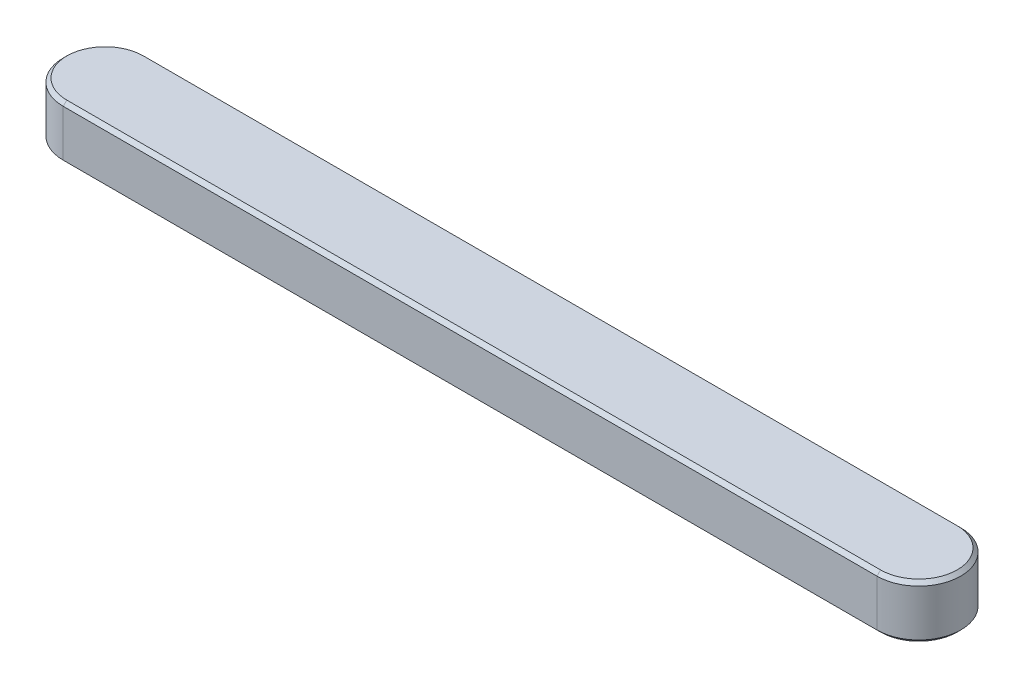
ISO-10303-21;
HEADER;
FILE_DESCRIPTION(('STEP AP214'),'2;1');
FILE_NAME('part.step','',(''),(''),'','','');
FILE_SCHEMA(('AUTOMOTIVE_DESIGN { 1 0 10303 214 1 1 1 1 }'));
ENDSEC;
DATA;
#1=APPLICATION_CONTEXT('core data for automotive mechanical design processes');
#2=APPLICATION_PROTOCOL_DEFINITION('international standard','automotive_design',2000,#1);
#3=PRODUCT_CONTEXT('',#1,'mechanical');
#4=PRODUCT('Part','Part','',(#3));
#5=PRODUCT_RELATED_PRODUCT_CATEGORY('part','',(#4));
#6=PRODUCT_DEFINITION_FORMATION('','',#4);
#7=PRODUCT_DEFINITION_CONTEXT('part definition',#1,'design');
#8=PRODUCT_DEFINITION('design','',#6,#7);
#9=PRODUCT_DEFINITION_SHAPE('','',#8);
#10=(LENGTH_UNIT() NAMED_UNIT(*) SI_UNIT(.MILLI.,.METRE.));
#11=(NAMED_UNIT(*) PLANE_ANGLE_UNIT() SI_UNIT($,.RADIAN.));
#12=(NAMED_UNIT(*) SI_UNIT($,.STERADIAN.) SOLID_ANGLE_UNIT());
#13=UNCERTAINTY_MEASURE_WITH_UNIT(LENGTH_MEASURE(1.E-05),#10,'distance_accuracy_value','');
#14=(GEOMETRIC_REPRESENTATION_CONTEXT(3) GLOBAL_UNCERTAINTY_ASSIGNED_CONTEXT((#13)) GLOBAL_UNIT_ASSIGNED_CONTEXT((#10,
#11,#12)) REPRESENTATION_CONTEXT('',''));
#15=CARTESIAN_POINT('',(0.,0.,0.));
#16=DIRECTION('',(0.,0.,1.));
#17=DIRECTION('',(1.,0.,0.));
#18=AXIS2_PLACEMENT_3D('',#15,#16,#17);
#19=CARTESIAN_POINT('',(7.,0.,0.));
#20=DIRECTION('',(0.,-1.,0.));
#21=DIRECTION('',(0.,0.,-1.));
#22=AXIS2_PLACEMENT_3D('',#19,#20,#21);
#23=PLANE('',#22);
#24=DIRECTION('',(1.,0.,0.));
#25=VECTOR('',#24,1.);
#26=CARTESIAN_POINT('',(7.,0.,-6.4));
#27=LINE('',#26,#25);
#28=CARTESIAN_POINT('',(7.,0.,-6.4));
#29=VERTEX_POINT('',#28);
#30=CARTESIAN_POINT('',(143.,0.,-6.4));
#31=VERTEX_POINT('',#30);
#32=EDGE_CURVE('E11',#29,#31,#27,.T.);
#33=ORIENTED_EDGE('',*,*,#32,.T.);
#34=CARTESIAN_POINT('',(143.,0.,0.));
#35=DIRECTION('',(0.,-1.,0.));
#36=DIRECTION('',(0.,0.,-1.));
#37=AXIS2_PLACEMENT_3D('',#34,#35,#36);
#38=CIRCLE('',#37,6.4);
#39=CARTESIAN_POINT('',(143.,0.,6.4));
#40=VERTEX_POINT('',#39);
#41=EDGE_CURVE('E121',#31,#40,#38,.T.);
#42=ORIENTED_EDGE('',*,*,#41,.T.);
#43=DIRECTION('',(1.,0.,0.));
#44=VECTOR('',#43,1.);
#45=CARTESIAN_POINT('',(7.,0.,6.4));
#46=LINE('',#45,#44);
#47=CARTESIAN_POINT('',(7.,0.,6.4));
#48=VERTEX_POINT('',#47);
#49=EDGE_CURVE('E91',#48,#40,#46,.T.);
#50=ORIENTED_EDGE('',*,*,#49,.F.);
#51=CARTESIAN_POINT('',(7.,0.,0.));
#52=DIRECTION('',(0.,1.,0.));
#53=DIRECTION('',(0.,0.,-1.));
#54=AXIS2_PLACEMENT_3D('',#51,#52,#53);
#55=CIRCLE('',#54,6.4);
#56=EDGE_CURVE('E104',#29,#48,#55,.T.);
#57=ORIENTED_EDGE('',*,*,#56,.F.);
#58=EDGE_LOOP('',(#33,#42,#50,#57));
#59=FACE_BOUND('',#58,.T.);
#60=ADVANCED_FACE('F16',(#59),#23,.T.);
#61=CARTESIAN_POINT('',(7.,0.3,-6.7));
#62=DIRECTION('',(0.,-0.707106781186547,-0.707106781186548));
#63=DIRECTION('',(0.,0.707106781186548,-0.707106781186547));
#64=AXIS2_PLACEMENT_3D('',#61,#62,#63);
#65=PLANE('',#64);
#66=DIRECTION('',(0.,-0.707106781186548,0.707106781186547));
#67=VECTOR('',#66,1.);
#68=CARTESIAN_POINT('',(143.,0.,-6.4));
#69=LINE('',#68,#67);
#70=CARTESIAN_POINT('',(143.,0.6,-7.));
#71=VERTEX_POINT('',#70);
#72=EDGE_CURVE('E119',#71,#31,#69,.T.);
#73=ORIENTED_EDGE('',*,*,#72,.T.);
#74=ORIENTED_EDGE('',*,*,#32,.F.);
#75=DIRECTION('',(0.,0.707106781186548,-0.707106781186547));
#76=VECTOR('',#75,1.);
#77=CARTESIAN_POINT('',(7.,0.,-6.4));
#78=LINE('',#77,#76);
#79=CARTESIAN_POINT('',(7.,0.6,-7.));
#80=VERTEX_POINT('',#79);
#81=EDGE_CURVE('E114',#29,#80,#78,.T.);
#82=ORIENTED_EDGE('',*,*,#81,.T.);
#83=DIRECTION('',(1.,0.,0.));
#84=VECTOR('',#83,1.);
#85=CARTESIAN_POINT('',(7.,0.6,-7.));
#86=LINE('',#85,#84);
#87=EDGE_CURVE('E26',#80,#71,#86,.T.);
#88=ORIENTED_EDGE('',*,*,#87,.T.);
#89=EDGE_LOOP('',(#73,#74,#82,#88));
#90=FACE_BOUND('',#89,.T.);
#91=ADVANCED_FACE('F18',(#90),#65,.T.);
#92=CARTESIAN_POINT('',(7.,4.5,-7.));
#93=DIRECTION('',(0.,0.,-1.));
#94=DIRECTION('',(0.,1.,0.));
#95=AXIS2_PLACEMENT_3D('',#92,#93,#94);
#96=PLANE('',#95);
#97=DIRECTION('',(0.,-1.,0.));
#98=VECTOR('',#97,1.);
#99=CARTESIAN_POINT('',(143.,0.6,-7.));
#100=LINE('',#99,#98);
#101=CARTESIAN_POINT('',(143.,8.4,-7.));
#102=VERTEX_POINT('',#101);
#103=EDGE_CURVE('E138',#102,#71,#100,.T.);
#104=ORIENTED_EDGE('',*,*,#103,.T.);
#105=ORIENTED_EDGE('',*,*,#87,.F.);
#106=DIRECTION('',(0.,1.,0.));
#107=VECTOR('',#106,1.);
#108=CARTESIAN_POINT('',(7.,0.6,-7.));
#109=LINE('',#108,#107);
#110=CARTESIAN_POINT('',(7.,8.4,-7.));
#111=VERTEX_POINT('',#110);
#112=EDGE_CURVE('E111',#80,#111,#109,.T.);
#113=ORIENTED_EDGE('',*,*,#112,.T.);
#114=DIRECTION('',(1.,0.,0.));
#115=VECTOR('',#114,1.);
#116=CARTESIAN_POINT('',(7.,8.4,-7.));
#117=LINE('',#116,#115);
#118=EDGE_CURVE('E147',#111,#102,#117,.T.);
#119=ORIENTED_EDGE('',*,*,#118,.T.);
#120=EDGE_LOOP('',(#104,#105,#113,#119));
#121=FACE_BOUND('',#120,.T.);
#122=ADVANCED_FACE('F175',(#121),#96,.T.);
#123=CARTESIAN_POINT('',(7.,8.7,-6.7));
#124=DIRECTION('',(0.,0.707106781186548,-0.707106781186548));
#125=DIRECTION('',(0.,0.707106781186548,0.707106781186548));
#126=AXIS2_PLACEMENT_3D('',#123,#124,#125);
#127=PLANE('',#126);
#128=DIRECTION('',(0.,-0.707106781186548,-0.707106781186548));
#129=VECTOR('',#128,1.);
#130=CARTESIAN_POINT('',(143.,8.4,-7.));
#131=LINE('',#130,#129);
#132=CARTESIAN_POINT('',(143.,9.,-6.4));
#133=VERTEX_POINT('',#132);
#134=EDGE_CURVE('E134',#133,#102,#131,.T.);
#135=ORIENTED_EDGE('',*,*,#134,.T.);
#136=ORIENTED_EDGE('',*,*,#118,.F.);
#137=DIRECTION('',(0.,0.707106781186548,0.707106781186548));
#138=VECTOR('',#137,1.);
#139=CARTESIAN_POINT('',(7.,8.4,-7.));
#140=LINE('',#139,#138);
#141=CARTESIAN_POINT('',(7.,9.,-6.4));
#142=VERTEX_POINT('',#141);
#143=EDGE_CURVE('E92',#111,#142,#140,.T.);
#144=ORIENTED_EDGE('',*,*,#143,.T.);
#145=DIRECTION('',(1.,0.,0.));
#146=VECTOR('',#145,1.);
#147=CARTESIAN_POINT('',(7.,9.,-6.4));
#148=LINE('',#147,#146);
#149=EDGE_CURVE('E35',#142,#133,#148,.T.);
#150=ORIENTED_EDGE('',*,*,#149,.T.);
#151=EDGE_LOOP('',(#135,#136,#144,#150));
#152=FACE_BOUND('',#151,.T.);
#153=ADVANCED_FACE('F172',(#152),#127,.T.);
#154=CARTESIAN_POINT('',(7.,9.,0.));
#155=DIRECTION('',(0.,1.,0.));
#156=DIRECTION('',(0.,0.,1.));
#157=AXIS2_PLACEMENT_3D('',#154,#155,#156);
#158=PLANE('',#157);
#159=DIRECTION('',(1.,0.,0.));
#160=VECTOR('',#159,1.);
#161=CARTESIAN_POINT('',(7.,9.,6.4));
#162=LINE('',#161,#160);
#163=CARTESIAN_POINT('',(7.,9.,6.4));
#164=VERTEX_POINT('',#163);
#165=CARTESIAN_POINT('',(143.,9.,6.4));
#166=VERTEX_POINT('',#165);
#167=EDGE_CURVE('E151',#164,#166,#162,.T.);
#168=ORIENTED_EDGE('',*,*,#167,.T.);
#169=CARTESIAN_POINT('',(143.,9.,0.));
#170=DIRECTION('',(0.,-1.,0.));
#171=DIRECTION('',(0.,0.,-1.));
#172=AXIS2_PLACEMENT_3D('',#169,#170,#171);
#173=CIRCLE('',#172,6.4);
#174=EDGE_CURVE('E130',#133,#166,#173,.T.);
#175=ORIENTED_EDGE('',*,*,#174,.F.);
#176=ORIENTED_EDGE('',*,*,#149,.F.);
#177=CARTESIAN_POINT('',(7.,9.,0.));
#178=DIRECTION('',(0.,1.,0.));
#179=DIRECTION('',(0.,0.,-1.));
#180=AXIS2_PLACEMENT_3D('',#177,#178,#179);
#181=CIRCLE('',#180,6.4);
#182=EDGE_CURVE('E129',#142,#164,#181,.T.);
#183=ORIENTED_EDGE('',*,*,#182,.T.);
#184=EDGE_LOOP('',(#168,#175,#176,#183));
#185=FACE_BOUND('',#184,.T.);
#186=ADVANCED_FACE('F165',(#185),#158,.T.);
#187=CARTESIAN_POINT('',(7.,8.7,6.7));
#188=DIRECTION('',(0.,0.707106781186548,0.707106781186547));
#189=DIRECTION('',(0.,-0.707106781186547,0.707106781186548));
#190=AXIS2_PLACEMENT_3D('',#187,#188,#189);
#191=PLANE('',#190);
#192=DIRECTION('',(0.,0.707106781186547,-0.707106781186548));
#193=VECTOR('',#192,1.);
#194=CARTESIAN_POINT('',(143.,9.,6.4));
#195=LINE('',#194,#193);
#196=CARTESIAN_POINT('',(143.,8.4,7.));
#197=VERTEX_POINT('',#196);
#198=EDGE_CURVE('E20',#197,#166,#195,.T.);
#199=ORIENTED_EDGE('',*,*,#198,.T.);
#200=ORIENTED_EDGE('',*,*,#167,.F.);
#201=DIRECTION('',(0.,-0.707106781186547,0.707106781186548));
#202=VECTOR('',#201,1.);
#203=CARTESIAN_POINT('',(7.,9.,6.4));
#204=LINE('',#203,#202);
#205=CARTESIAN_POINT('',(7.,8.4,7.));
#206=VERTEX_POINT('',#205);
#207=EDGE_CURVE('E127',#164,#206,#204,.T.);
#208=ORIENTED_EDGE('',*,*,#207,.T.);
#209=DIRECTION('',(1.,0.,0.));
#210=VECTOR('',#209,1.);
#211=CARTESIAN_POINT('',(7.,8.4,7.));
#212=LINE('',#211,#210);
#213=EDGE_CURVE('E99',#206,#197,#212,.T.);
#214=ORIENTED_EDGE('',*,*,#213,.T.);
#215=EDGE_LOOP('',(#199,#200,#208,#214));
#216=FACE_BOUND('',#215,.T.);
#217=ADVANCED_FACE('F171',(#216),#191,.T.);
#218=CARTESIAN_POINT('',(7.,4.5,7.));
#219=DIRECTION('',(0.,0.,1.));
#220=DIRECTION('',(0.,-1.,0.));
#221=AXIS2_PLACEMENT_3D('',#218,#219,#220);
#222=PLANE('',#221);
#223=DIRECTION('',(0.,1.,0.));
#224=VECTOR('',#223,1.);
#225=CARTESIAN_POINT('',(143.,8.4,7.));
#226=LINE('',#225,#224);
#227=CARTESIAN_POINT('',(143.,0.6,7.));
#228=VERTEX_POINT('',#227);
#229=EDGE_CURVE('E133',#228,#197,#226,.T.);
#230=ORIENTED_EDGE('',*,*,#229,.T.);
#231=ORIENTED_EDGE('',*,*,#213,.F.);
#232=DIRECTION('',(0.,-1.,0.));
#233=VECTOR('',#232,1.);
#234=CARTESIAN_POINT('',(7.,8.4,7.));
#235=LINE('',#234,#233);
#236=CARTESIAN_POINT('',(7.,0.6,7.));
#237=VERTEX_POINT('',#236);
#238=EDGE_CURVE('E96',#206,#237,#235,.T.);
#239=ORIENTED_EDGE('',*,*,#238,.T.);
#240=DIRECTION('',(1.,0.,0.));
#241=VECTOR('',#240,1.);
#242=CARTESIAN_POINT('',(7.,0.6,7.));
#243=LINE('',#242,#241);
#244=EDGE_CURVE('E75',#237,#228,#243,.T.);
#245=ORIENTED_EDGE('',*,*,#244,.T.);
#246=EDGE_LOOP('',(#230,#231,#239,#245));
#247=FACE_BOUND('',#246,.T.);
#248=ADVANCED_FACE('F98',(#247),#222,.T.);
#249=CARTESIAN_POINT('',(7.,0.3,6.7));
#250=DIRECTION('',(0.,-0.707106781186548,0.707106781186548));
#251=DIRECTION('',(0.,-0.707106781186548,-0.707106781186548));
#252=AXIS2_PLACEMENT_3D('',#249,#250,#251);
#253=PLANE('',#252);
#254=DIRECTION('',(0.,0.707106781186548,0.707106781186548));
#255=VECTOR('',#254,1.);
#256=CARTESIAN_POINT('',(143.,0.6,7.));
#257=LINE('',#256,#255);
#258=EDGE_CURVE('E89',#40,#228,#257,.T.);
#259=ORIENTED_EDGE('',*,*,#258,.T.);
#260=ORIENTED_EDGE('',*,*,#244,.F.);
#261=DIRECTION('',(0.,-0.707106781186548,-0.707106781186548));
#262=VECTOR('',#261,1.);
#263=CARTESIAN_POINT('',(7.,0.6,7.));
#264=LINE('',#263,#262);
#265=EDGE_CURVE('E87',#237,#48,#264,.T.);
#266=ORIENTED_EDGE('',*,*,#265,.T.);
#267=ORIENTED_EDGE('',*,*,#49,.T.);
#268=EDGE_LOOP('',(#259,#260,#266,#267));
#269=FACE_BOUND('',#268,.T.);
#270=ADVANCED_FACE('F85',(#269),#253,.T.);
#271=CARTESIAN_POINT('',(7.,8.7,0.));
#272=DIRECTION('',(0.,-1.,0.));
#273=DIRECTION('',(0.,0.,-1.));
#274=AXIS2_PLACEMENT_3D('',#271,#272,#273);
#275=CONICAL_SURFACE('',#274,6.7,0.785398163397448);
#276=ORIENTED_EDGE('',*,*,#207,.F.);
#277=ORIENTED_EDGE('',*,*,#182,.F.);
#278=ORIENTED_EDGE('',*,*,#143,.F.);
#279=CARTESIAN_POINT('',(7.,8.4,0.));
#280=DIRECTION('',(0.,1.,0.));
#281=DIRECTION('',(0.,0.,-1.));
#282=AXIS2_PLACEMENT_3D('',#279,#280,#281);
#283=CIRCLE('',#282,7.);
#284=EDGE_CURVE('E103',#111,#206,#283,.T.);
#285=ORIENTED_EDGE('',*,*,#284,.T.);
#286=EDGE_LOOP('',(#276,#277,#278,#285));
#287=FACE_BOUND('',#286,.T.);
#288=ADVANCED_FACE('F168',(#287),#275,.T.);
#289=CARTESIAN_POINT('',(7.,4.5,0.));
#290=DIRECTION('',(0.,-1.,0.));
#291=DIRECTION('',(0.,0.,-1.));
#292=AXIS2_PLACEMENT_3D('',#289,#290,#291);
#293=CYLINDRICAL_SURFACE('',#292,7.);
#294=ORIENTED_EDGE('',*,*,#238,.F.);
#295=ORIENTED_EDGE('',*,*,#284,.F.);
#296=ORIENTED_EDGE('',*,*,#112,.F.);
#297=CARTESIAN_POINT('',(7.,0.6,0.));
#298=DIRECTION('',(0.,1.,0.));
#299=DIRECTION('',(0.,0.,-1.));
#300=AXIS2_PLACEMENT_3D('',#297,#298,#299);
#301=CIRCLE('',#300,7.);
#302=EDGE_CURVE('E108',#80,#237,#301,.T.);
#303=ORIENTED_EDGE('',*,*,#302,.T.);
#304=EDGE_LOOP('',(#294,#295,#296,#303));
#305=FACE_BOUND('',#304,.T.);
#306=ADVANCED_FACE('F109',(#305),#293,.T.);
#307=CARTESIAN_POINT('',(7.,0.3,0.));
#308=DIRECTION('',(0.,1.,0.));
#309=DIRECTION('',(0.,0.,-1.));
#310=AXIS2_PLACEMENT_3D('',#307,#308,#309);
#311=CONICAL_SURFACE('',#310,6.7,0.785398163397448);
#312=ORIENTED_EDGE('',*,*,#265,.F.);
#313=ORIENTED_EDGE('',*,*,#302,.F.);
#314=ORIENTED_EDGE('',*,*,#81,.F.);
#315=ORIENTED_EDGE('',*,*,#56,.T.);
#316=EDGE_LOOP('',(#312,#313,#314,#315));
#317=FACE_BOUND('',#316,.T.);
#318=ADVANCED_FACE('F117',(#317),#311,.T.);
#319=CARTESIAN_POINT('',(143.,0.3,0.));
#320=DIRECTION('',(0.,1.,0.));
#321=DIRECTION('',(0.,0.,-1.));
#322=AXIS2_PLACEMENT_3D('',#319,#320,#321);
#323=CONICAL_SURFACE('',#322,6.7,0.785398163397448);
#324=ORIENTED_EDGE('',*,*,#258,.F.);
#325=ORIENTED_EDGE('',*,*,#41,.F.);
#326=ORIENTED_EDGE('',*,*,#72,.F.);
#327=CARTESIAN_POINT('',(143.,0.6,0.));
#328=DIRECTION('',(0.,-1.,0.));
#329=DIRECTION('',(0.,0.,-1.));
#330=AXIS2_PLACEMENT_3D('',#327,#328,#329);
#331=CIRCLE('',#330,7.);
#332=EDGE_CURVE('E141',#71,#228,#331,.T.);
#333=ORIENTED_EDGE('',*,*,#332,.T.);
#334=EDGE_LOOP('',(#324,#325,#326,#333));
#335=FACE_BOUND('',#334,.T.);
#336=ADVANCED_FACE('F181',(#335),#323,.T.);
#337=CARTESIAN_POINT('',(143.,4.5,0.));
#338=DIRECTION('',(0.,1.,0.));
#339=DIRECTION('',(0.,0.,-1.));
#340=AXIS2_PLACEMENT_3D('',#337,#338,#339);
#341=CYLINDRICAL_SURFACE('',#340,7.);
#342=ORIENTED_EDGE('',*,*,#229,.F.);
#343=ORIENTED_EDGE('',*,*,#332,.F.);
#344=ORIENTED_EDGE('',*,*,#103,.F.);
#345=CARTESIAN_POINT('',(143.,8.4,0.));
#346=DIRECTION('',(0.,-1.,0.));
#347=DIRECTION('',(0.,0.,-1.));
#348=AXIS2_PLACEMENT_3D('',#345,#346,#347);
#349=CIRCLE('',#348,7.);
#350=EDGE_CURVE('E137',#102,#197,#349,.T.);
#351=ORIENTED_EDGE('',*,*,#350,.T.);
#352=EDGE_LOOP('',(#342,#343,#344,#351));
#353=FACE_BOUND('',#352,.T.);
#354=ADVANCED_FACE('F179',(#353),#341,.T.);
#355=CARTESIAN_POINT('',(143.,8.7,0.));
#356=DIRECTION('',(0.,-1.,0.));
#357=DIRECTION('',(0.,0.,-1.));
#358=AXIS2_PLACEMENT_3D('',#355,#356,#357);
#359=CONICAL_SURFACE('',#358,6.7,0.785398163397448);
#360=ORIENTED_EDGE('',*,*,#198,.F.);
#361=ORIENTED_EDGE('',*,*,#350,.F.);
#362=ORIENTED_EDGE('',*,*,#134,.F.);
#363=ORIENTED_EDGE('',*,*,#174,.T.);
#364=EDGE_LOOP('',(#360,#361,#362,#363));
#365=FACE_BOUND('',#364,.T.);
#366=ADVANCED_FACE('F194',(#365),#359,.T.);
#367=CLOSED_SHELL('',(#60,#91,#122,#153,#186,#217,#248,#270,#288,#306,#318,#336,#354,#366));
#368=MANIFOLD_SOLID_BREP('B1',#367);
#369=ADVANCED_BREP_SHAPE_REPRESENTATION('',(#18,#368),#14);
#370=SHAPE_DEFINITION_REPRESENTATION(#9,#369);
ENDSEC;
END-ISO-10303-21;
